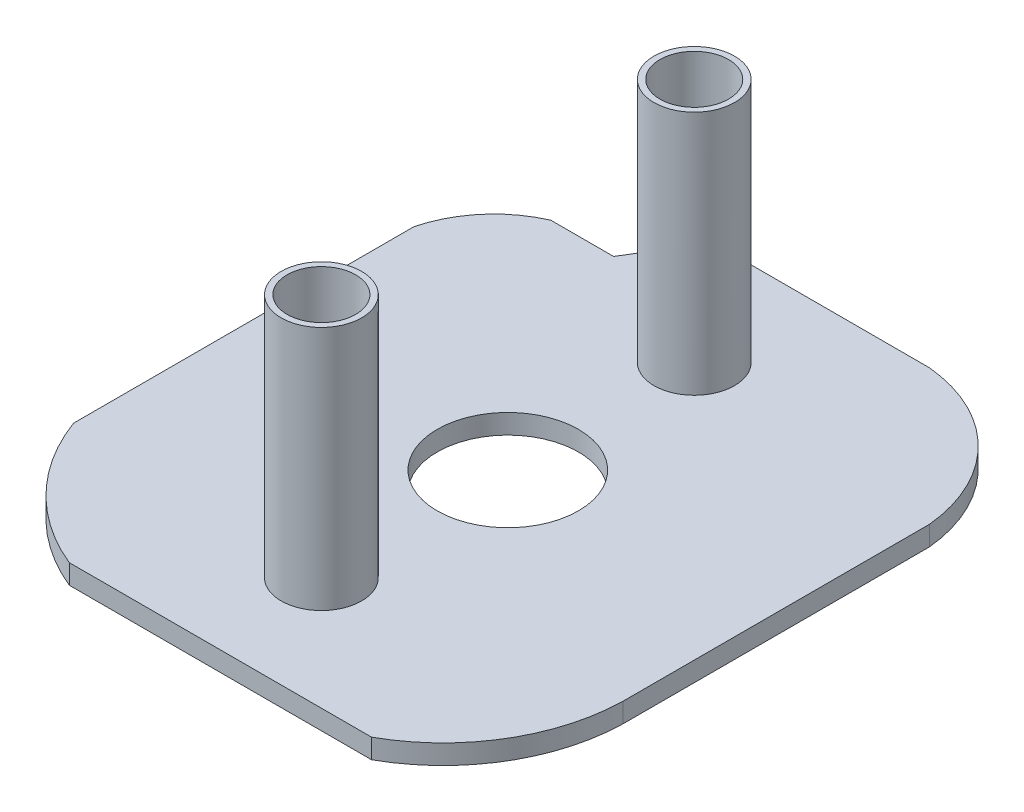
ISO-10303-21;
HEADER;
FILE_DESCRIPTION(('STEP AP214'),'2;1');
FILE_NAME('part.step','',(''),(''),'','','');
FILE_SCHEMA(('AUTOMOTIVE_DESIGN { 1 0 10303 214 1 1 1 1 }'));
ENDSEC;
DATA;
#1=APPLICATION_CONTEXT('core data for automotive mechanical design processes');
#2=APPLICATION_PROTOCOL_DEFINITION('international standard','automotive_design',2000,#1);
#3=PRODUCT_CONTEXT('',#1,'mechanical');
#4=PRODUCT('Part','Part','',(#3));
#5=PRODUCT_RELATED_PRODUCT_CATEGORY('part','',(#4));
#6=PRODUCT_DEFINITION_FORMATION('','',#4);
#7=PRODUCT_DEFINITION_CONTEXT('part definition',#1,'design');
#8=PRODUCT_DEFINITION('design','',#6,#7);
#9=PRODUCT_DEFINITION_SHAPE('','',#8);
#10=(LENGTH_UNIT() NAMED_UNIT(*) SI_UNIT(.MILLI.,.METRE.));
#11=(NAMED_UNIT(*) PLANE_ANGLE_UNIT() SI_UNIT($,.RADIAN.));
#12=(NAMED_UNIT(*) SI_UNIT($,.STERADIAN.) SOLID_ANGLE_UNIT());
#13=UNCERTAINTY_MEASURE_WITH_UNIT(LENGTH_MEASURE(1.E-05),#10,'distance_accuracy_value','');
#14=(GEOMETRIC_REPRESENTATION_CONTEXT(3) GLOBAL_UNCERTAINTY_ASSIGNED_CONTEXT((#13)) GLOBAL_UNIT_ASSIGNED_CONTEXT((#10,
#11,#12)) REPRESENTATION_CONTEXT('',''));
#15=CARTESIAN_POINT('',(0.,0.,0.));
#16=DIRECTION('',(0.,0.,1.));
#17=DIRECTION('',(1.,0.,0.));
#18=AXIS2_PLACEMENT_3D('',#15,#16,#17);
#19=CARTESIAN_POINT('',(0.,10.,0.));
#20=DIRECTION('',(0.,-1.,0.));
#21=DIRECTION('',(0.,0.,-1.));
#22=AXIS2_PLACEMENT_3D('',#19,#20,#21);
#23=PLANE('',#22);
#24=CARTESIAN_POINT('',(-1.30841518175551E-12,10.,95.04));
#25=DIRECTION('',(0.,-1.,0.));
#26=DIRECTION('',(0.,0.,-1.));
#27=AXIS2_PLACEMENT_3D('',#24,#25,#26);
#28=CIRCLE('',#27,20.52);
#29=CARTESIAN_POINT('',(-1.30841518175551E-12,10.,74.52));
#30=VERTEX_POINT('',#29);
#31=EDGE_CURVE('E11',#30,#30,#28,.F.);
#32=ORIENTED_EDGE('',*,*,#31,.F.);
#33=EDGE_LOOP('',(#32));
#34=FACE_BOUND('',#33,.T.);
#35=CARTESIAN_POINT('',(0.,10.,-95.04));
#36=DIRECTION('',(0.,-1.,0.));
#37=DIRECTION('',(0.,0.,-1.));
#38=AXIS2_PLACEMENT_3D('',#35,#36,#37);
#39=CIRCLE('',#38,20.52);
#40=CARTESIAN_POINT('',(0.,10.,-115.56));
#41=VERTEX_POINT('',#40);
#42=EDGE_CURVE('E47',#41,#41,#39,.F.);
#43=ORIENTED_EDGE('',*,*,#42,.F.);
#44=EDGE_LOOP('',(#43));
#45=FACE_BOUND('',#44,.T.);
#46=CARTESIAN_POINT('',(0.,10.,0.));
#47=DIRECTION('',(0.,-1.,0.));
#48=DIRECTION('',(0.,0.,-1.));
#49=AXIS2_PLACEMENT_3D('',#46,#47,#48);
#50=CIRCLE('',#49,36.);
#51=CARTESIAN_POINT('',(0.,10.,-36.));
#52=VERTEX_POINT('',#51);
#53=EDGE_CURVE('E192',#52,#52,#50,.T.);
#54=ORIENTED_EDGE('',*,*,#53,.T.);
#55=EDGE_LOOP('',(#54));
#56=FACE_BOUND('',#55,.T.);
#57=DIRECTION('',(-1.,0.,0.));
#58=VECTOR('',#57,1.);
#59=CARTESIAN_POINT('',(-131.4,10.,-152.64));
#60=LINE('',#59,#58);
#61=CARTESIAN_POINT('',(62.2799999999993,10.,-152.64));
#62=VERTEX_POINT('',#61);
#63=CARTESIAN_POINT('',(-48.1593420898172,10.,-152.64));
#64=VERTEX_POINT('',#63);
#65=EDGE_CURVE('E151',#62,#64,#60,.T.);
#66=ORIENTED_EDGE('',*,*,#65,.T.);
#67=DIRECTION('',(-0.52196564210467,0.,0.852966510750721));
#68=VECTOR('',#67,1.);
#69=CARTESIAN_POINT('',(-102.996679913968,10.,-63.0279471565971));
#70=LINE('',#69,#68);
#71=CARTESIAN_POINT('',(-67.3454683106027,10.,-121.287125754525));
#72=VERTEX_POINT('',#71);
#73=EDGE_CURVE('E220',#64,#72,#70,.T.);
#74=ORIENTED_EDGE('',*,*,#73,.T.);
#75=DIRECTION('',(-1.,0.,0.));
#76=VECTOR('',#75,1.);
#77=CARTESIAN_POINT('',(0.,10.,-121.287125754525));
#78=LINE('',#77,#76);
#79=CARTESIAN_POINT('',(-99.3727341553014,10.,-121.287125754525));
#80=VERTEX_POINT('',#79);
#81=EDGE_CURVE('E166',#72,#80,#78,.T.);
#82=ORIENTED_EDGE('',*,*,#81,.T.);
#83=CARTESIAN_POINT('',(-76.5886532674374,10.,-69.5023380807909));
#84=DIRECTION('',(0.,1.,0.));
#85=DIRECTION('',(0.,0.,1.));
#86=AXIS2_PLACEMENT_3D('',#83,#84,#85);
#87=CIRCLE('',#86,56.5754237838167);
#88=CARTESIAN_POINT('',(-131.4,10.,-83.52));
#89=VERTEX_POINT('',#88);
#90=EDGE_CURVE('E164',#89,#80,#87,.F.);
#91=ORIENTED_EDGE('',*,*,#90,.F.);
#92=DIRECTION('',(0.,0.,1.));
#93=VECTOR('',#92,1.);
#94=CARTESIAN_POINT('',(-131.4,10.,152.64));
#95=LINE('',#94,#93);
#96=CARTESIAN_POINT('',(-131.4,10.,90.));
#97=VERTEX_POINT('',#96);
#98=EDGE_CURVE('E225',#89,#97,#95,.T.);
#99=ORIENTED_EDGE('',*,*,#98,.T.);
#100=CARTESIAN_POINT('',(-30.0902527311731,10.,52.7009336714775));
#101=DIRECTION('',(0.,1.,0.));
#102=DIRECTION('',(0.,0.,1.));
#103=AXIS2_PLACEMENT_3D('',#100,#101,#102);
#104=CIRCLE('',#103,107.957793793005);
#105=CARTESIAN_POINT('',(-70.92,10.,152.64));
#106=VERTEX_POINT('',#105);
#107=EDGE_CURVE('E158',#106,#97,#104,.F.);
#108=ORIENTED_EDGE('',*,*,#107,.F.);
#109=DIRECTION('',(1.,0.,0.));
#110=VECTOR('',#109,1.);
#111=CARTESIAN_POINT('',(-131.4,10.,152.64));
#112=LINE('',#111,#110);
#113=CARTESIAN_POINT('',(83.16,10.,152.64));
#114=VERTEX_POINT('',#113);
#115=EDGE_CURVE('E168',#106,#114,#112,.T.);
#116=ORIENTED_EDGE('',*,*,#115,.T.);
#117=CARTESIAN_POINT('',(37.7003567408536,10.,70.681476591326));
#118=DIRECTION('',(0.,1.,0.));
#119=DIRECTION('',(0.,0.,1.));
#120=AXIS2_PLACEMENT_3D('',#117,#118,#119);
#121=CIRCLE('',#120,93.721815627841);
#122=CARTESIAN_POINT('',(131.4,10.,72.72));
#123=VERTEX_POINT('',#122);
#124=EDGE_CURVE('E124',#123,#114,#121,.F.);
#125=ORIENTED_EDGE('',*,*,#124,.F.);
#126=DIRECTION('',(0.,0.,-1.));
#127=VECTOR('',#126,1.);
#128=CARTESIAN_POINT('',(131.4,10.,152.64));
#129=LINE('',#128,#127);
#130=CARTESIAN_POINT('',(131.4,10.,-83.52));
#131=VERTEX_POINT('',#130);
#132=EDGE_CURVE('E147',#123,#131,#129,.T.);
#133=ORIENTED_EDGE('',*,*,#132,.T.);
#134=CARTESIAN_POINT('',(55.0799999999997,10.,-76.3199999999996));
#135=DIRECTION('',(0.,1.,0.));
#136=DIRECTION('',(0.,0.,1.));
#137=AXIS2_PLACEMENT_3D('',#134,#135,#136);
#138=CIRCLE('',#137,76.6588703282279);
#139=EDGE_CURVE('E162',#62,#131,#138,.F.);
#140=ORIENTED_EDGE('',*,*,#139,.F.);
#141=EDGE_LOOP('',(#66,#74,#82,#91,#99,#108,#116,#125,#133,#140));
#142=FACE_BOUND('',#141,.T.);
#143=ADVANCED_FACE('F37',(#34,#45,#56,#142),#23,.F.);
#144=CARTESIAN_POINT('',(0.,0.,0.));
#145=DIRECTION('',(0.,-1.,0.));
#146=DIRECTION('',(0.,0.,-1.));
#147=AXIS2_PLACEMENT_3D('',#144,#145,#146);
#148=PLANE('',#147);
#149=CARTESIAN_POINT('',(0.,0.,-95.04));
#150=DIRECTION('',(0.,1.,0.));
#151=DIRECTION('',(0.,0.,1.));
#152=AXIS2_PLACEMENT_3D('',#149,#150,#151);
#153=CIRCLE('',#152,17.5);
#154=CARTESIAN_POINT('',(0.,0.,-77.54));
#155=VERTEX_POINT('',#154);
#156=EDGE_CURVE('E171',#155,#155,#153,.T.);
#157=ORIENTED_EDGE('',*,*,#156,.T.);
#158=EDGE_LOOP('',(#157));
#159=FACE_BOUND('',#158,.T.);
#160=CARTESIAN_POINT('',(0.,0.,95.04));
#161=DIRECTION('',(0.,1.,0.));
#162=DIRECTION('',(0.,0.,-1.));
#163=AXIS2_PLACEMENT_3D('',#160,#161,#162);
#164=CIRCLE('',#163,17.5);
#165=CARTESIAN_POINT('',(0.,0.,77.54));
#166=VERTEX_POINT('',#165);
#167=EDGE_CURVE('E177',#166,#166,#164,.T.);
#168=ORIENTED_EDGE('',*,*,#167,.T.);
#169=EDGE_LOOP('',(#168));
#170=FACE_BOUND('',#169,.T.);
#171=CARTESIAN_POINT('',(0.,0.,0.));
#172=DIRECTION('',(0.,1.,0.));
#173=DIRECTION('',(0.,0.,1.));
#174=AXIS2_PLACEMENT_3D('',#171,#172,#173);
#175=CIRCLE('',#174,36.);
#176=CARTESIAN_POINT('',(0.,0.,36.));
#177=VERTEX_POINT('',#176);
#178=EDGE_CURVE('E189',#177,#177,#175,.T.);
#179=ORIENTED_EDGE('',*,*,#178,.T.);
#180=EDGE_LOOP('',(#179));
#181=FACE_BOUND('',#180,.T.);
#182=DIRECTION('',(0.52196564210467,0.,-0.852966510750721));
#183=VECTOR('',#182,1.);
#184=CARTESIAN_POINT('',(-67.3454683106027,0.,-121.287125754525));
#185=LINE('',#184,#183);
#186=CARTESIAN_POINT('',(-67.3454683106027,0.,-121.287125754525));
#187=VERTEX_POINT('',#186);
#188=CARTESIAN_POINT('',(-48.1593420898172,0.,-152.64));
#189=VERTEX_POINT('',#188);
#190=EDGE_CURVE('E205',#187,#189,#185,.T.);
#191=ORIENTED_EDGE('',*,*,#190,.T.);
#192=DIRECTION('',(-1.,0.,0.));
#193=VECTOR('',#192,1.);
#194=CARTESIAN_POINT('',(-131.4,0.,-152.64));
#195=LINE('',#194,#193);
#196=CARTESIAN_POINT('',(62.2799999999992,0.,-152.64));
#197=VERTEX_POINT('',#196);
#198=EDGE_CURVE('E154',#197,#189,#195,.T.);
#199=ORIENTED_EDGE('',*,*,#198,.F.);
#200=CARTESIAN_POINT('',(55.0799999999997,0.,-76.3199999999996));
#201=DIRECTION('',(0.,-1.,0.));
#202=DIRECTION('',(0.,0.,-1.));
#203=AXIS2_PLACEMENT_3D('',#200,#201,#202);
#204=CIRCLE('',#203,76.6588703282279);
#205=CARTESIAN_POINT('',(131.4,0.,-83.52));
#206=VERTEX_POINT('',#205);
#207=EDGE_CURVE('E196',#197,#206,#204,.T.);
#208=ORIENTED_EDGE('',*,*,#207,.T.);
#209=DIRECTION('',(0.,0.,-1.));
#210=VECTOR('',#209,1.);
#211=CARTESIAN_POINT('',(131.4,0.,152.64));
#212=LINE('',#211,#210);
#213=CARTESIAN_POINT('',(131.4,0.,72.72));
#214=VERTEX_POINT('',#213);
#215=EDGE_CURVE('E141',#214,#206,#212,.T.);
#216=ORIENTED_EDGE('',*,*,#215,.F.);
#217=CARTESIAN_POINT('',(37.7003567408536,0.,70.681476591326));
#218=DIRECTION('',(0.,-1.,0.));
#219=DIRECTION('',(0.,0.,1.));
#220=AXIS2_PLACEMENT_3D('',#217,#218,#219);
#221=CIRCLE('',#220,93.721815627841);
#222=CARTESIAN_POINT('',(83.16,0.,152.64));
#223=VERTEX_POINT('',#222);
#224=EDGE_CURVE('E121',#214,#223,#221,.T.);
#225=ORIENTED_EDGE('',*,*,#224,.T.);
#226=DIRECTION('',(1.,0.,0.));
#227=VECTOR('',#226,1.);
#228=CARTESIAN_POINT('',(-131.4,0.,152.64));
#229=LINE('',#228,#227);
#230=CARTESIAN_POINT('',(-70.92,0.,152.64));
#231=VERTEX_POINT('',#230);
#232=EDGE_CURVE('E138',#231,#223,#229,.T.);
#233=ORIENTED_EDGE('',*,*,#232,.F.);
#234=CARTESIAN_POINT('',(-30.0902527311731,0.,52.7009336714775));
#235=DIRECTION('',(0.,-1.,0.));
#236=DIRECTION('',(0.,0.,-1.));
#237=AXIS2_PLACEMENT_3D('',#234,#235,#236);
#238=CIRCLE('',#237,107.957793793005);
#239=CARTESIAN_POINT('',(-131.4,0.,90.));
#240=VERTEX_POINT('',#239);
#241=EDGE_CURVE('E129',#231,#240,#238,.T.);
#242=ORIENTED_EDGE('',*,*,#241,.T.);
#243=DIRECTION('',(0.,0.,1.));
#244=VECTOR('',#243,1.);
#245=CARTESIAN_POINT('',(-131.4,0.,152.64));
#246=LINE('',#245,#244);
#247=CARTESIAN_POINT('',(-131.4,0.,-83.52));
#248=VERTEX_POINT('',#247);
#249=EDGE_CURVE('E148',#248,#240,#246,.T.);
#250=ORIENTED_EDGE('',*,*,#249,.F.);
#251=CARTESIAN_POINT('',(-76.5886532674374,0.,-69.5023380807909));
#252=DIRECTION('',(0.,-1.,0.));
#253=DIRECTION('',(0.,0.,-1.));
#254=AXIS2_PLACEMENT_3D('',#251,#252,#253);
#255=CIRCLE('',#254,56.5754237838167);
#256=CARTESIAN_POINT('',(-99.3727341553014,0.,-121.287125754525));
#257=VERTEX_POINT('',#256);
#258=EDGE_CURVE('E98',#248,#257,#255,.T.);
#259=ORIENTED_EDGE('',*,*,#258,.T.);
#260=DIRECTION('',(1.,0.,0.));
#261=VECTOR('',#260,1.);
#262=CARTESIAN_POINT('',(-99.3727341553014,0.,-121.287125754525));
#263=LINE('',#262,#261);
#264=EDGE_CURVE('E56',#257,#187,#263,.T.);
#265=ORIENTED_EDGE('',*,*,#264,.T.);
#266=EDGE_LOOP('',(#191,#199,#208,#216,#225,#233,#242,#250,#259,#265));
#267=FACE_BOUND('',#266,.T.);
#268=ADVANCED_FACE('F136',(#159,#170,#181,#267),#148,.T.);
#269=CARTESIAN_POINT('',(131.4,10.,152.64));
#270=DIRECTION('',(-1.,0.,0.));
#271=DIRECTION('',(0.,0.,1.));
#272=AXIS2_PLACEMENT_3D('',#269,#270,#271);
#273=PLANE('',#272);
#274=ORIENTED_EDGE('',*,*,#215,.T.);
#275=DIRECTION('',(0.,1.,0.));
#276=VECTOR('',#275,1.);
#277=CARTESIAN_POINT('',(131.4,0.,-83.52));
#278=LINE('',#277,#276);
#279=EDGE_CURVE('E198',#206,#131,#278,.T.);
#280=ORIENTED_EDGE('',*,*,#279,.T.);
#281=ORIENTED_EDGE('',*,*,#132,.F.);
#282=DIRECTION('',(0.,1.,0.));
#283=VECTOR('',#282,1.);
#284=CARTESIAN_POINT('',(131.4,0.,72.72));
#285=LINE('',#284,#283);
#286=EDGE_CURVE('E130',#214,#123,#285,.T.);
#287=ORIENTED_EDGE('',*,*,#286,.F.);
#288=EDGE_LOOP('',(#274,#280,#281,#287));
#289=FACE_BOUND('',#288,.T.);
#290=ADVANCED_FACE('F39',(#289),#273,.F.);
#291=CARTESIAN_POINT('',(-131.4,10.,-152.64));
#292=DIRECTION('',(0.,0.,1.));
#293=DIRECTION('',(1.,0.,0.));
#294=AXIS2_PLACEMENT_3D('',#291,#292,#293);
#295=PLANE('',#294);
#296=ORIENTED_EDGE('',*,*,#198,.T.);
#297=DIRECTION('',(0.,1.,0.));
#298=VECTOR('',#297,1.);
#299=CARTESIAN_POINT('',(-48.1593420898172,0.,-152.64));
#300=LINE('',#299,#298);
#301=EDGE_CURVE('E199',#189,#64,#300,.T.);
#302=ORIENTED_EDGE('',*,*,#301,.T.);
#303=ORIENTED_EDGE('',*,*,#65,.F.);
#304=DIRECTION('',(0.,1.,0.));
#305=VECTOR('',#304,1.);
#306=CARTESIAN_POINT('',(62.2799999999992,0.,-152.64));
#307=LINE('',#306,#305);
#308=EDGE_CURVE('E142',#197,#62,#307,.T.);
#309=ORIENTED_EDGE('',*,*,#308,.F.);
#310=EDGE_LOOP('',(#296,#302,#303,#309));
#311=FACE_BOUND('',#310,.T.);
#312=ADVANCED_FACE('F233',(#311),#295,.F.);
#313=CARTESIAN_POINT('',(-131.4,10.,152.64));
#314=DIRECTION('',(1.,0.,0.));
#315=DIRECTION('',(0.,0.,-1.));
#316=AXIS2_PLACEMENT_3D('',#313,#314,#315);
#317=PLANE('',#316);
#318=ORIENTED_EDGE('',*,*,#98,.F.);
#319=DIRECTION('',(0.,1.,0.));
#320=VECTOR('',#319,1.);
#321=CARTESIAN_POINT('',(-131.4,0.,-83.52));
#322=LINE('',#321,#320);
#323=EDGE_CURVE('E90',#248,#89,#322,.T.);
#324=ORIENTED_EDGE('',*,*,#323,.F.);
#325=ORIENTED_EDGE('',*,*,#249,.T.);
#326=DIRECTION('',(0.,1.,0.));
#327=VECTOR('',#326,1.);
#328=CARTESIAN_POINT('',(-131.4,0.,90.));
#329=LINE('',#328,#327);
#330=EDGE_CURVE('E160',#240,#97,#329,.T.);
#331=ORIENTED_EDGE('',*,*,#330,.T.);
#332=EDGE_LOOP('',(#318,#324,#325,#331));
#333=FACE_BOUND('',#332,.T.);
#334=ADVANCED_FACE('F248',(#333),#317,.F.);
#335=CARTESIAN_POINT('',(-131.4,10.,152.64));
#336=DIRECTION('',(0.,0.,-1.));
#337=DIRECTION('',(-1.,0.,0.));
#338=AXIS2_PLACEMENT_3D('',#335,#336,#337);
#339=PLANE('',#338);
#340=ORIENTED_EDGE('',*,*,#232,.T.);
#341=DIRECTION('',(0.,1.,0.));
#342=VECTOR('',#341,1.);
#343=CARTESIAN_POINT('',(83.16,0.,152.64));
#344=LINE('',#343,#342);
#345=EDGE_CURVE('E118',#223,#114,#344,.T.);
#346=ORIENTED_EDGE('',*,*,#345,.T.);
#347=ORIENTED_EDGE('',*,*,#115,.F.);
#348=DIRECTION('',(0.,1.,0.));
#349=VECTOR('',#348,1.);
#350=CARTESIAN_POINT('',(-70.92,0.,152.64));
#351=LINE('',#350,#349);
#352=EDGE_CURVE('E146',#231,#106,#351,.T.);
#353=ORIENTED_EDGE('',*,*,#352,.F.);
#354=EDGE_LOOP('',(#340,#346,#347,#353));
#355=FACE_BOUND('',#354,.T.);
#356=ADVANCED_FACE('F145',(#355),#339,.F.);
#357=CARTESIAN_POINT('',(-30.0902527311731,0.,52.7009336714775));
#358=DIRECTION('',(0.,1.,0.));
#359=DIRECTION('',(0.,0.,1.));
#360=AXIS2_PLACEMENT_3D('',#357,#358,#359);
#361=CYLINDRICAL_SURFACE('',#360,107.957793793005);
#362=ORIENTED_EDGE('',*,*,#330,.F.);
#363=ORIENTED_EDGE('',*,*,#241,.F.);
#364=ORIENTED_EDGE('',*,*,#352,.T.);
#365=ORIENTED_EDGE('',*,*,#107,.T.);
#366=EDGE_LOOP('',(#362,#363,#364,#365));
#367=FACE_BOUND('',#366,.T.);
#368=ADVANCED_FACE('F246',(#367),#361,.T.);
#369=CARTESIAN_POINT('',(37.7003567408536,0.,70.681476591326));
#370=DIRECTION('',(0.,1.,0.));
#371=DIRECTION('',(0.,0.,1.));
#372=AXIS2_PLACEMENT_3D('',#369,#370,#371);
#373=CYLINDRICAL_SURFACE('',#372,93.721815627841);
#374=ORIENTED_EDGE('',*,*,#345,.F.);
#375=ORIENTED_EDGE('',*,*,#224,.F.);
#376=ORIENTED_EDGE('',*,*,#286,.T.);
#377=ORIENTED_EDGE('',*,*,#124,.T.);
#378=EDGE_LOOP('',(#374,#375,#376,#377));
#379=FACE_BOUND('',#378,.T.);
#380=ADVANCED_FACE('F120',(#379),#373,.T.);
#381=CARTESIAN_POINT('',(55.0799999999997,0.,-76.3199999999996));
#382=DIRECTION('',(0.,1.,0.));
#383=DIRECTION('',(0.,0.,1.));
#384=AXIS2_PLACEMENT_3D('',#381,#382,#383);
#385=CYLINDRICAL_SURFACE('',#384,76.6588703282279);
#386=ORIENTED_EDGE('',*,*,#279,.F.);
#387=ORIENTED_EDGE('',*,*,#207,.F.);
#388=ORIENTED_EDGE('',*,*,#308,.T.);
#389=ORIENTED_EDGE('',*,*,#139,.T.);
#390=EDGE_LOOP('',(#386,#387,#388,#389));
#391=FACE_BOUND('',#390,.T.);
#392=ADVANCED_FACE('F238',(#391),#385,.T.);
#393=CARTESIAN_POINT('',(-67.3454683106027,0.,-121.287125754525));
#394=DIRECTION('',(0.852966510750721,0.,0.52196564210467));
#395=DIRECTION('',(0.52196564210467,0.,-0.852966510750721));
#396=AXIS2_PLACEMENT_3D('',#393,#394,#395);
#397=PLANE('',#396);
#398=ORIENTED_EDGE('',*,*,#301,.F.);
#399=ORIENTED_EDGE('',*,*,#190,.F.);
#400=DIRECTION('',(0.,1.,0.));
#401=VECTOR('',#400,1.);
#402=CARTESIAN_POINT('',(-67.3454683106027,0.,-121.287125754525));
#403=LINE('',#402,#401);
#404=EDGE_CURVE('E209',#187,#72,#403,.T.);
#405=ORIENTED_EDGE('',*,*,#404,.T.);
#406=ORIENTED_EDGE('',*,*,#73,.F.);
#407=EDGE_LOOP('',(#398,#399,#405,#406));
#408=FACE_BOUND('',#407,.T.);
#409=ADVANCED_FACE('F276',(#408),#397,.F.);
#410=CARTESIAN_POINT('',(-99.3727341553014,0.,-121.287125754525));
#411=DIRECTION('',(0.,0.,1.));
#412=DIRECTION('',(1.,0.,0.));
#413=AXIS2_PLACEMENT_3D('',#410,#411,#412);
#414=PLANE('',#413);
#415=ORIENTED_EDGE('',*,*,#404,.F.);
#416=ORIENTED_EDGE('',*,*,#264,.F.);
#417=DIRECTION('',(0.,1.,0.));
#418=VECTOR('',#417,1.);
#419=CARTESIAN_POINT('',(-99.3727341553014,0.,-121.287125754525));
#420=LINE('',#419,#418);
#421=EDGE_CURVE('E94',#257,#80,#420,.T.);
#422=ORIENTED_EDGE('',*,*,#421,.T.);
#423=ORIENTED_EDGE('',*,*,#81,.F.);
#424=EDGE_LOOP('',(#415,#416,#422,#423));
#425=FACE_BOUND('',#424,.T.);
#426=ADVANCED_FACE('F273',(#425),#414,.F.);
#427=CARTESIAN_POINT('',(-76.5886532674374,0.,-69.5023380807909));
#428=DIRECTION('',(0.,1.,0.));
#429=DIRECTION('',(0.,0.,1.));
#430=AXIS2_PLACEMENT_3D('',#427,#428,#429);
#431=CYLINDRICAL_SURFACE('',#430,56.5754237838167);
#432=ORIENTED_EDGE('',*,*,#421,.F.);
#433=ORIENTED_EDGE('',*,*,#258,.F.);
#434=ORIENTED_EDGE('',*,*,#323,.T.);
#435=ORIENTED_EDGE('',*,*,#90,.T.);
#436=EDGE_LOOP('',(#432,#433,#434,#435));
#437=FACE_BOUND('',#436,.T.);
#438=ADVANCED_FACE('F269',(#437),#431,.T.);
#439=CARTESIAN_POINT('',(0.,0.,0.));
#440=DIRECTION('',(0.,1.,0.));
#441=DIRECTION('',(0.,0.,1.));
#442=AXIS2_PLACEMENT_3D('',#439,#440,#441);
#443=CYLINDRICAL_SURFACE('',#442,36.);
#444=ORIENTED_EDGE('',*,*,#178,.F.);
#445=EDGE_LOOP('',(#444));
#446=FACE_BOUND('',#445,.T.);
#447=ORIENTED_EDGE('',*,*,#53,.F.);
#448=EDGE_LOOP('',(#447));
#449=FACE_BOUND('',#448,.T.);
#450=ADVANCED_FACE('F272',(#446,#449),#443,.F.);
#451=CARTESIAN_POINT('',(0.,135.,-95.04));
#452=DIRECTION('',(0.,-1.,0.));
#453=DIRECTION('',(0.,0.,-1.));
#454=AXIS2_PLACEMENT_3D('',#451,#452,#453);
#455=CYLINDRICAL_SURFACE('',#454,20.52);
#456=CARTESIAN_POINT('',(0.,135.,-95.04));
#457=DIRECTION('',(0.,1.,0.));
#458=DIRECTION('',(0.,0.,1.));
#459=AXIS2_PLACEMENT_3D('',#456,#457,#458);
#460=CIRCLE('',#459,20.52);
#461=CARTESIAN_POINT('',(0.,135.,-74.52));
#462=VERTEX_POINT('',#461);
#463=EDGE_CURVE('E186',#462,#462,#460,.T.);
#464=ORIENTED_EDGE('',*,*,#463,.F.);
#465=EDGE_LOOP('',(#464));
#466=FACE_BOUND('',#465,.T.);
#467=ORIENTED_EDGE('',*,*,#42,.T.);
#468=EDGE_LOOP('',(#467));
#469=FACE_BOUND('',#468,.T.);
#470=ADVANCED_FACE('F286',(#466,#469),#455,.T.);
#471=CARTESIAN_POINT('',(0.,135.,-95.04));
#472=DIRECTION('',(0.,1.,0.));
#473=DIRECTION('',(0.,0.,1.));
#474=AXIS2_PLACEMENT_3D('',#471,#472,#473);
#475=PLANE('',#474);
#476=CARTESIAN_POINT('',(0.,135.,-95.04));
#477=DIRECTION('',(0.,1.,0.));
#478=DIRECTION('',(0.,0.,1.));
#479=AXIS2_PLACEMENT_3D('',#476,#477,#478);
#480=CIRCLE('',#479,17.5);
#481=CARTESIAN_POINT('',(0.,135.,-77.54));
#482=VERTEX_POINT('',#481);
#483=EDGE_CURVE('E41',#482,#482,#480,.T.);
#484=ORIENTED_EDGE('',*,*,#483,.F.);
#485=EDGE_LOOP('',(#484));
#486=FACE_BOUND('',#485,.T.);
#487=ORIENTED_EDGE('',*,*,#463,.T.);
#488=EDGE_LOOP('',(#487));
#489=FACE_BOUND('',#488,.T.);
#490=ADVANCED_FACE('F290',(#486,#489),#475,.T.);
#491=CARTESIAN_POINT('',(-1.30841518175551E-12,135.,95.04));
#492=DIRECTION('',(0.,-1.,0.));
#493=DIRECTION('',(0.,0.,-1.));
#494=AXIS2_PLACEMENT_3D('',#491,#492,#493);
#495=CYLINDRICAL_SURFACE('',#494,20.52);
#496=CARTESIAN_POINT('',(-1.30841518175551E-12,135.,95.04));
#497=DIRECTION('',(0.,1.,0.));
#498=DIRECTION('',(0.,0.,-1.));
#499=AXIS2_PLACEMENT_3D('',#496,#497,#498);
#500=CIRCLE('',#499,20.52);
#501=CARTESIAN_POINT('',(-1.30841518175551E-12,135.,74.52));
#502=VERTEX_POINT('',#501);
#503=EDGE_CURVE('E175',#502,#502,#500,.T.);
#504=ORIENTED_EDGE('',*,*,#503,.F.);
#505=EDGE_LOOP('',(#504));
#506=FACE_BOUND('',#505,.T.);
#507=ORIENTED_EDGE('',*,*,#31,.T.);
#508=EDGE_LOOP('',(#507));
#509=FACE_BOUND('',#508,.T.);
#510=ADVANCED_FACE('F294',(#506,#509),#495,.T.);
#511=CARTESIAN_POINT('',(-1.30841518175551E-12,135.,95.04));
#512=DIRECTION('',(0.,-1.,0.));
#513=DIRECTION('',(0.,0.,-1.));
#514=AXIS2_PLACEMENT_3D('',#511,#512,#513);
#515=PLANE('',#514);
#516=CARTESIAN_POINT('',(0.,135.,95.04));
#517=DIRECTION('',(0.,-1.,0.));
#518=DIRECTION('',(0.,0.,-1.));
#519=AXIS2_PLACEMENT_3D('',#516,#517,#518);
#520=CIRCLE('',#519,17.5);
#521=CARTESIAN_POINT('',(0.,135.,77.54));
#522=VERTEX_POINT('',#521);
#523=EDGE_CURVE('E169',#522,#522,#520,.T.);
#524=ORIENTED_EDGE('',*,*,#523,.T.);
#525=EDGE_LOOP('',(#524));
#526=FACE_BOUND('',#525,.T.);
#527=ORIENTED_EDGE('',*,*,#503,.T.);
#528=EDGE_LOOP('',(#527));
#529=FACE_BOUND('',#528,.T.);
#530=ADVANCED_FACE('F298',(#526,#529),#515,.F.);
#531=CARTESIAN_POINT('',(0.,0.,95.04));
#532=DIRECTION('',(0.,1.,0.));
#533=DIRECTION('',(0.,0.,1.));
#534=AXIS2_PLACEMENT_3D('',#531,#532,#533);
#535=CYLINDRICAL_SURFACE('',#534,17.5);
#536=ORIENTED_EDGE('',*,*,#167,.F.);
#537=EDGE_LOOP('',(#536));
#538=FACE_BOUND('',#537,.T.);
#539=ORIENTED_EDGE('',*,*,#523,.F.);
#540=EDGE_LOOP('',(#539));
#541=FACE_BOUND('',#540,.T.);
#542=ADVANCED_FACE('F302',(#538,#541),#535,.F.);
#543=CARTESIAN_POINT('',(0.,0.,-95.04));
#544=DIRECTION('',(0.,1.,0.));
#545=DIRECTION('',(0.,0.,1.));
#546=AXIS2_PLACEMENT_3D('',#543,#544,#545);
#547=CYLINDRICAL_SURFACE('',#546,17.5);
#548=ORIENTED_EDGE('',*,*,#483,.T.);
#549=EDGE_LOOP('',(#548));
#550=FACE_BOUND('',#549,.T.);
#551=ORIENTED_EDGE('',*,*,#156,.F.);
#552=EDGE_LOOP('',(#551));
#553=FACE_BOUND('',#552,.T.);
#554=ADVANCED_FACE('F305',(#550,#553),#547,.F.);
#555=CLOSED_SHELL('',(#143,#268,#290,#312,#334,#356,#368,#380,#392,#409,#426,#438,#450,#470,
#490,#510,#530,#542,#554));
#556=MANIFOLD_SOLID_BREP('B2',#555);
#557=ADVANCED_BREP_SHAPE_REPRESENTATION('',(#18,#556),#14);
#558=SHAPE_DEFINITION_REPRESENTATION(#9,#557);
ENDSEC;
END-ISO-10303-21;
